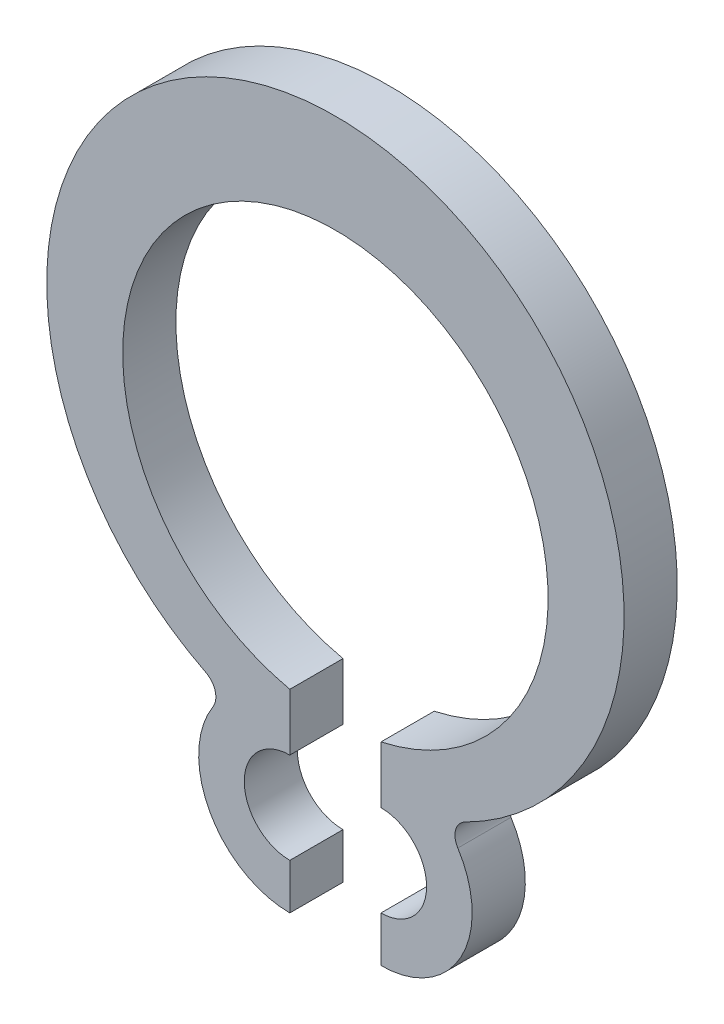
ISO-10303-21;
HEADER;
FILE_DESCRIPTION(('STEP AP214'),'2;1');
FILE_NAME('part.step','',(''),(''),'','','');
FILE_SCHEMA(('AUTOMOTIVE_DESIGN { 1 0 10303 214 1 1 1 1 }'));
ENDSEC;
DATA;
#1=APPLICATION_CONTEXT('core data for automotive mechanical design processes');
#2=APPLICATION_PROTOCOL_DEFINITION('international standard','automotive_design',2000,#1);
#3=PRODUCT_CONTEXT('',#1,'mechanical');
#4=PRODUCT('Part','Part','',(#3));
#5=PRODUCT_RELATED_PRODUCT_CATEGORY('part','',(#4));
#6=PRODUCT_DEFINITION_FORMATION('','',#4);
#7=PRODUCT_DEFINITION_CONTEXT('part definition',#1,'design');
#8=PRODUCT_DEFINITION('design','',#6,#7);
#9=PRODUCT_DEFINITION_SHAPE('','',#8);
#10=(LENGTH_UNIT() NAMED_UNIT(*) SI_UNIT(.MILLI.,.METRE.));
#11=(NAMED_UNIT(*) PLANE_ANGLE_UNIT() SI_UNIT($,.RADIAN.));
#12=(NAMED_UNIT(*) SI_UNIT($,.STERADIAN.) SOLID_ANGLE_UNIT());
#13=UNCERTAINTY_MEASURE_WITH_UNIT(LENGTH_MEASURE(1.E-05),#10,'distance_accuracy_value','');
#14=(GEOMETRIC_REPRESENTATION_CONTEXT(3) GLOBAL_UNCERTAINTY_ASSIGNED_CONTEXT((#13)) GLOBAL_UNIT_ASSIGNED_CONTEXT((#10,
#11,#12)) REPRESENTATION_CONTEXT('',''));
#15=CARTESIAN_POINT('',(0.,0.,0.));
#16=DIRECTION('',(0.,0.,1.));
#17=DIRECTION('',(1.,0.,0.));
#18=AXIS2_PLACEMENT_3D('',#15,#16,#17);
#19=CARTESIAN_POINT('',(-0.6,-4.08495886623547,0.7));
#20=DIRECTION('',(0.,0.,-1.));
#21=DIRECTION('',(-1.,0.,0.));
#22=AXIS2_PLACEMENT_3D('',#19,#20,#21);
#23=CYLINDRICAL_SURFACE('',#22,1.2);
#24=CARTESIAN_POINT('',(-0.6,-4.08495886623547,0.));
#25=DIRECTION('',(0.,0.,1.));
#26=DIRECTION('',(1.,0.,0.));
#27=AXIS2_PLACEMENT_3D('',#24,#25,#26);
#28=CIRCLE('',#27,1.2);
#29=CARTESIAN_POINT('',(-1.61140871688524,-3.43916291749581,0.));
#30=VERTEX_POINT('',#29);
#31=CARTESIAN_POINT('',(-0.6,-5.28495886623547,0.));
#32=VERTEX_POINT('',#31);
#33=EDGE_CURVE('E166',#30,#32,#28,.T.);
#34=ORIENTED_EDGE('',*,*,#33,.T.);
#35=DIRECTION('',(0.,0.,-1.));
#36=VECTOR('',#35,1.);
#37=CARTESIAN_POINT('',(-0.6,-5.28495886623547,0.7));
#38=LINE('',#37,#36);
#39=CARTESIAN_POINT('',(-0.6,-5.28495886623547,0.7));
#40=VERTEX_POINT('',#39);
#41=EDGE_CURVE('E11',#40,#32,#38,.T.);
#42=ORIENTED_EDGE('',*,*,#41,.F.);
#43=CARTESIAN_POINT('',(-0.6,-4.08495886623547,0.7));
#44=DIRECTION('',(0.,0.,1.));
#45=DIRECTION('',(1.,0.,0.));
#46=AXIS2_PLACEMENT_3D('',#43,#44,#45);
#47=CIRCLE('',#46,1.2);
#48=CARTESIAN_POINT('',(-1.61140871688524,-3.43916291749581,0.7));
#49=VERTEX_POINT('',#48);
#50=EDGE_CURVE('E189',#49,#40,#47,.T.);
#51=ORIENTED_EDGE('',*,*,#50,.F.);
#52=DIRECTION('',(0.,0.,-1.));
#53=VECTOR('',#52,1.);
#54=CARTESIAN_POINT('',(-1.61140871688524,-3.43916291749581,0.7));
#55=LINE('',#54,#53);
#56=EDGE_CURVE('E162',#49,#30,#55,.T.);
#57=ORIENTED_EDGE('',*,*,#56,.T.);
#58=EDGE_LOOP('',(#34,#42,#51,#57));
#59=FACE_BOUND('',#58,.T.);
#60=ADVANCED_FACE('F42',(#59),#23,.T.);
#61=CARTESIAN_POINT('',(-0.6,-4.68495886623547,0.7));
#62=DIRECTION('',(-1.,0.,0.));
#63=DIRECTION('',(0.,-1.,0.));
#64=AXIS2_PLACEMENT_3D('',#61,#62,#63);
#65=PLANE('',#64);
#66=DIRECTION('',(0.,1.,0.));
#67=VECTOR('',#66,1.);
#68=CARTESIAN_POINT('',(-0.6,-4.68495886623547,0.));
#69=LINE('',#68,#67);
#70=CARTESIAN_POINT('',(-0.6,-4.68495886623547,0.));
#71=VERTEX_POINT('',#70);
#72=EDGE_CURVE('E169',#32,#71,#69,.T.);
#73=ORIENTED_EDGE('',*,*,#72,.T.);
#74=DIRECTION('',(0.,0.,-1.));
#75=VECTOR('',#74,1.);
#76=CARTESIAN_POINT('',(-0.6,-4.68495886623547,0.7));
#77=LINE('',#76,#75);
#78=CARTESIAN_POINT('',(-0.6,-4.68495886623547,0.7));
#79=VERTEX_POINT('',#78);
#80=EDGE_CURVE('E50',#79,#71,#77,.T.);
#81=ORIENTED_EDGE('',*,*,#80,.F.);
#82=DIRECTION('',(0.,1.,0.));
#83=VECTOR('',#82,1.);
#84=CARTESIAN_POINT('',(-0.6,-4.68495886623547,0.7));
#85=LINE('',#84,#83);
#86=EDGE_CURVE('E113',#40,#79,#85,.T.);
#87=ORIENTED_EDGE('',*,*,#86,.F.);
#88=ORIENTED_EDGE('',*,*,#41,.T.);
#89=EDGE_LOOP('',(#73,#81,#87,#88));
#90=FACE_BOUND('',#89,.T.);
#91=ADVANCED_FACE('F267',(#90),#65,.F.);
#92=CARTESIAN_POINT('',(-0.6,-4.08495886623547,0.7));
#93=DIRECTION('',(0.,0.,-1.));
#94=DIRECTION('',(-1.,0.,0.));
#95=AXIS2_PLACEMENT_3D('',#92,#93,#94);
#96=CYLINDRICAL_SURFACE('',#95,0.6);
#97=CARTESIAN_POINT('',(-0.6,-4.08495886623547,0.));
#98=DIRECTION('',(0.,0.,-1.));
#99=DIRECTION('',(1.,0.,0.));
#100=AXIS2_PLACEMENT_3D('',#97,#98,#99);
#101=CIRCLE('',#100,0.6);
#102=CARTESIAN_POINT('',(-0.6,-3.48495886623547,0.));
#103=VERTEX_POINT('',#102);
#104=EDGE_CURVE('E171',#71,#103,#101,.T.);
#105=ORIENTED_EDGE('',*,*,#104,.T.);
#106=DIRECTION('',(0.,0.,-1.));
#107=VECTOR('',#106,1.);
#108=CARTESIAN_POINT('',(-0.6,-3.48495886623547,0.7));
#109=LINE('',#108,#107);
#110=CARTESIAN_POINT('',(-0.6,-3.48495886623547,0.7));
#111=VERTEX_POINT('',#110);
#112=EDGE_CURVE('E208',#111,#103,#109,.T.);
#113=ORIENTED_EDGE('',*,*,#112,.F.);
#114=CARTESIAN_POINT('',(-0.6,-4.08495886623547,0.7));
#115=DIRECTION('',(0.,0.,-1.));
#116=DIRECTION('',(1.,0.,0.));
#117=AXIS2_PLACEMENT_3D('',#114,#115,#116);
#118=CIRCLE('',#117,0.6);
#119=EDGE_CURVE('E216',#79,#111,#118,.T.);
#120=ORIENTED_EDGE('',*,*,#119,.F.);
#121=ORIENTED_EDGE('',*,*,#80,.T.);
#122=EDGE_LOOP('',(#105,#113,#120,#121));
#123=FACE_BOUND('',#122,.T.);
#124=ADVANCED_FACE('F214',(#123),#96,.F.);
#125=CARTESIAN_POINT('',(-0.6,-2.73495886623547,0.7));
#126=DIRECTION('',(-1.,0.,0.));
#127=DIRECTION('',(0.,-1.,0.));
#128=AXIS2_PLACEMENT_3D('',#125,#126,#127);
#129=PLANE('',#128);
#130=DIRECTION('',(0.,1.,0.));
#131=VECTOR('',#130,1.);
#132=CARTESIAN_POINT('',(-0.6,-2.73495886623547,0.));
#133=LINE('',#132,#131);
#134=CARTESIAN_POINT('',(-0.599999999999999,-2.73495886623547,0.));
#135=VERTEX_POINT('',#134);
#136=EDGE_CURVE('E173',#103,#135,#133,.T.);
#137=ORIENTED_EDGE('',*,*,#136,.T.);
#138=DIRECTION('',(0.,0.,-1.));
#139=VECTOR('',#138,1.);
#140=CARTESIAN_POINT('',(-0.599999999999999,-2.73495886623547,0.7));
#141=LINE('',#140,#139);
#142=CARTESIAN_POINT('',(-0.599999999999999,-2.73495886623547,0.7));
#143=VERTEX_POINT('',#142);
#144=EDGE_CURVE('E205',#143,#135,#141,.T.);
#145=ORIENTED_EDGE('',*,*,#144,.F.);
#146=DIRECTION('',(0.,1.,0.));
#147=VECTOR('',#146,1.);
#148=CARTESIAN_POINT('',(-0.6,-2.73495886623547,0.7));
#149=LINE('',#148,#147);
#150=EDGE_CURVE('E234',#111,#143,#149,.T.);
#151=ORIENTED_EDGE('',*,*,#150,.F.);
#152=ORIENTED_EDGE('',*,*,#112,.T.);
#153=EDGE_LOOP('',(#137,#145,#151,#152));
#154=FACE_BOUND('',#153,.T.);
#155=ADVANCED_FACE('F225',(#154),#129,.F.);
#156=CARTESIAN_POINT('',(0.,0.,0.7));
#157=DIRECTION('',(0.,0.,-1.));
#158=DIRECTION('',(-1.,0.,0.));
#159=AXIS2_PLACEMENT_3D('',#156,#157,#158);
#160=CYLINDRICAL_SURFACE('',#159,2.8);
#161=CARTESIAN_POINT('',(0.,0.,0.));
#162=DIRECTION('',(0.,0.,-1.));
#163=DIRECTION('',(1.,0.,0.));
#164=AXIS2_PLACEMENT_3D('',#161,#162,#163);
#165=CIRCLE('',#164,2.8);
#166=CARTESIAN_POINT('',(0.6,-2.73495886623547,0.));
#167=VERTEX_POINT('',#166);
#168=EDGE_CURVE('E175',#135,#167,#165,.T.);
#169=ORIENTED_EDGE('',*,*,#168,.T.);
#170=DIRECTION('',(0.,0.,-1.));
#171=VECTOR('',#170,1.);
#172=CARTESIAN_POINT('',(0.6,-2.73495886623547,0.7));
#173=LINE('',#172,#171);
#174=CARTESIAN_POINT('',(0.6,-2.73495886623547,0.7));
#175=VERTEX_POINT('',#174);
#176=EDGE_CURVE('E202',#175,#167,#173,.T.);
#177=ORIENTED_EDGE('',*,*,#176,.F.);
#178=CARTESIAN_POINT('',(0.,0.,0.7));
#179=DIRECTION('',(0.,0.,-1.));
#180=DIRECTION('',(1.,0.,0.));
#181=AXIS2_PLACEMENT_3D('',#178,#179,#180);
#182=CIRCLE('',#181,2.8);
#183=EDGE_CURVE('E231',#143,#175,#182,.T.);
#184=ORIENTED_EDGE('',*,*,#183,.F.);
#185=ORIENTED_EDGE('',*,*,#144,.T.);
#186=EDGE_LOOP('',(#169,#177,#184,#185));
#187=FACE_BOUND('',#186,.T.);
#188=ADVANCED_FACE('F229',(#187),#160,.F.);
#189=CARTESIAN_POINT('',(0.6,-2.73495886623547,0.7));
#190=DIRECTION('',(1.,0.,0.));
#191=DIRECTION('',(0.,1.,0.));
#192=AXIS2_PLACEMENT_3D('',#189,#190,#191);
#193=PLANE('',#192);
#194=DIRECTION('',(0.,-1.,0.));
#195=VECTOR('',#194,1.);
#196=CARTESIAN_POINT('',(0.6,-2.73495886623547,0.));
#197=LINE('',#196,#195);
#198=CARTESIAN_POINT('',(0.6,-3.48495886623547,0.));
#199=VERTEX_POINT('',#198);
#200=EDGE_CURVE('E177',#167,#199,#197,.T.);
#201=ORIENTED_EDGE('',*,*,#200,.T.);
#202=DIRECTION('',(0.,0.,-1.));
#203=VECTOR('',#202,1.);
#204=CARTESIAN_POINT('',(0.6,-3.48495886623547,0.7));
#205=LINE('',#204,#203);
#206=CARTESIAN_POINT('',(0.6,-3.48495886623547,0.7));
#207=VERTEX_POINT('',#206);
#208=EDGE_CURVE('E199',#207,#199,#205,.T.);
#209=ORIENTED_EDGE('',*,*,#208,.F.);
#210=DIRECTION('',(0.,-1.,0.));
#211=VECTOR('',#210,1.);
#212=CARTESIAN_POINT('',(0.6,-2.73495886623547,0.7));
#213=LINE('',#212,#211);
#214=EDGE_CURVE('E233',#175,#207,#213,.T.);
#215=ORIENTED_EDGE('',*,*,#214,.F.);
#216=ORIENTED_EDGE('',*,*,#176,.T.);
#217=EDGE_LOOP('',(#201,#209,#215,#216));
#218=FACE_BOUND('',#217,.T.);
#219=ADVANCED_FACE('F280',(#218),#193,.F.);
#220=CARTESIAN_POINT('',(0.6,-4.08495886623547,0.7));
#221=DIRECTION('',(0.,0.,-1.));
#222=DIRECTION('',(-1.,0.,0.));
#223=AXIS2_PLACEMENT_3D('',#220,#221,#222);
#224=CYLINDRICAL_SURFACE('',#223,0.6);
#225=CARTESIAN_POINT('',(0.6,-4.08495886623547,0.));
#226=DIRECTION('',(0.,0.,-1.));
#227=DIRECTION('',(1.,0.,0.));
#228=AXIS2_PLACEMENT_3D('',#225,#226,#227);
#229=CIRCLE('',#228,0.6);
#230=CARTESIAN_POINT('',(0.6,-4.68495886623547,0.));
#231=VERTEX_POINT('',#230);
#232=EDGE_CURVE('E179',#199,#231,#229,.T.);
#233=ORIENTED_EDGE('',*,*,#232,.T.);
#234=DIRECTION('',(0.,0.,-1.));
#235=VECTOR('',#234,1.);
#236=CARTESIAN_POINT('',(0.6,-4.68495886623547,0.7));
#237=LINE('',#236,#235);
#238=CARTESIAN_POINT('',(0.6,-4.68495886623547,0.7));
#239=VERTEX_POINT('',#238);
#240=EDGE_CURVE('E196',#239,#231,#237,.T.);
#241=ORIENTED_EDGE('',*,*,#240,.F.);
#242=CARTESIAN_POINT('',(0.6,-4.08495886623547,0.7));
#243=DIRECTION('',(0.,0.,-1.));
#244=DIRECTION('',(1.,0.,0.));
#245=AXIS2_PLACEMENT_3D('',#242,#243,#244);
#246=CIRCLE('',#245,0.6);
#247=EDGE_CURVE('E236',#207,#239,#246,.T.);
#248=ORIENTED_EDGE('',*,*,#247,.F.);
#249=ORIENTED_EDGE('',*,*,#208,.T.);
#250=EDGE_LOOP('',(#233,#241,#248,#249));
#251=FACE_BOUND('',#250,.T.);
#252=ADVANCED_FACE('F283',(#251),#224,.F.);
#253=CARTESIAN_POINT('',(0.6,-4.68495886623547,0.7));
#254=DIRECTION('',(1.,0.,0.));
#255=DIRECTION('',(0.,1.,0.));
#256=AXIS2_PLACEMENT_3D('',#253,#254,#255);
#257=PLANE('',#256);
#258=DIRECTION('',(0.,-1.,0.));
#259=VECTOR('',#258,1.);
#260=CARTESIAN_POINT('',(0.6,-4.68495886623547,0.));
#261=LINE('',#260,#259);
#262=CARTESIAN_POINT('',(0.6,-5.28495886623547,0.));
#263=VERTEX_POINT('',#262);
#264=EDGE_CURVE('E181',#231,#263,#261,.T.);
#265=ORIENTED_EDGE('',*,*,#264,.T.);
#266=DIRECTION('',(0.,0.,-1.));
#267=VECTOR('',#266,1.);
#268=CARTESIAN_POINT('',(0.6,-5.28495886623547,0.7));
#269=LINE('',#268,#267);
#270=CARTESIAN_POINT('',(0.6,-5.28495886623547,0.7));
#271=VERTEX_POINT('',#270);
#272=EDGE_CURVE('E193',#271,#263,#269,.T.);
#273=ORIENTED_EDGE('',*,*,#272,.F.);
#274=DIRECTION('',(0.,-1.,0.));
#275=VECTOR('',#274,1.);
#276=CARTESIAN_POINT('',(0.6,-4.68495886623547,0.7));
#277=LINE('',#276,#275);
#278=EDGE_CURVE('E242',#239,#271,#277,.T.);
#279=ORIENTED_EDGE('',*,*,#278,.F.);
#280=ORIENTED_EDGE('',*,*,#240,.T.);
#281=EDGE_LOOP('',(#265,#273,#279,#280));
#282=FACE_BOUND('',#281,.T.);
#283=ADVANCED_FACE('F248',(#282),#257,.F.);
#284=CARTESIAN_POINT('',(0.6,-4.08495886623547,0.7));
#285=DIRECTION('',(0.,0.,-1.));
#286=DIRECTION('',(-1.,0.,0.));
#287=AXIS2_PLACEMENT_3D('',#284,#285,#286);
#288=CYLINDRICAL_SURFACE('',#287,1.2);
#289=CARTESIAN_POINT('',(0.6,-4.08495886623547,0.));
#290=DIRECTION('',(0.,0.,1.));
#291=DIRECTION('',(1.,0.,0.));
#292=AXIS2_PLACEMENT_3D('',#289,#290,#291);
#293=CIRCLE('',#292,1.2);
#294=CARTESIAN_POINT('',(1.61140871688524,-3.43916291749581,0.));
#295=VERTEX_POINT('',#294);
#296=EDGE_CURVE('E183',#263,#295,#293,.T.);
#297=ORIENTED_EDGE('',*,*,#296,.T.);
#298=DIRECTION('',(0.,0.,-1.));
#299=VECTOR('',#298,1.);
#300=CARTESIAN_POINT('',(1.61140871688524,-3.43916291749581,0.7));
#301=LINE('',#300,#299);
#302=CARTESIAN_POINT('',(1.61140871688524,-3.43916291749581,0.7));
#303=VERTEX_POINT('',#302);
#304=EDGE_CURVE('E153',#303,#295,#301,.T.);
#305=ORIENTED_EDGE('',*,*,#304,.F.);
#306=CARTESIAN_POINT('',(0.6,-4.08495886623547,0.7));
#307=DIRECTION('',(0.,0.,1.));
#308=DIRECTION('',(1.,0.,0.));
#309=AXIS2_PLACEMENT_3D('',#306,#307,#308);
#310=CIRCLE('',#309,1.2);
#311=EDGE_CURVE('E144',#271,#303,#310,.T.);
#312=ORIENTED_EDGE('',*,*,#311,.F.);
#313=ORIENTED_EDGE('',*,*,#272,.T.);
#314=EDGE_LOOP('',(#297,#305,#312,#313));
#315=FACE_BOUND('',#314,.T.);
#316=ADVANCED_FACE('F252',(#315),#288,.T.);
#317=CARTESIAN_POINT('',(1.81369046026228,-3.31000372774788,0.7));
#318=DIRECTION('',(0.,0.,-1.));
#319=DIRECTION('',(-1.,0.,0.));
#320=AXIS2_PLACEMENT_3D('',#317,#318,#319);
#321=CYLINDRICAL_SURFACE('',#320,0.239999999999999);
#322=CARTESIAN_POINT('',(1.81369046026228,-3.31000372774788,0.));
#323=DIRECTION('',(0.,0.,-1.));
#324=DIRECTION('',(1.,0.,0.));
#325=AXIS2_PLACEMENT_3D('',#322,#323,#324);
#326=CIRCLE('',#325,0.239999999999999);
#327=CARTESIAN_POINT('',(1.70594647252393,-3.09554806075296,0.));
#328=VERTEX_POINT('',#327);
#329=EDGE_CURVE('E152',#295,#328,#326,.T.);
#330=ORIENTED_EDGE('',*,*,#329,.T.);
#331=DIRECTION('',(0.,0.,-1.));
#332=VECTOR('',#331,1.);
#333=CARTESIAN_POINT('',(1.70594647252393,-3.09554806075296,0.7));
#334=LINE('',#333,#332);
#335=CARTESIAN_POINT('',(1.70594647252393,-3.09554806075296,0.7));
#336=VERTEX_POINT('',#335);
#337=EDGE_CURVE('E149',#336,#328,#334,.T.);
#338=ORIENTED_EDGE('',*,*,#337,.F.);
#339=CARTESIAN_POINT('',(1.81369046026228,-3.31000372774788,0.7));
#340=DIRECTION('',(0.,0.,-1.));
#341=DIRECTION('',(1.,0.,0.));
#342=AXIS2_PLACEMENT_3D('',#339,#340,#341);
#343=CIRCLE('',#342,0.239999999999999);
#344=EDGE_CURVE('E138',#303,#336,#343,.T.);
#345=ORIENTED_EDGE('',*,*,#344,.F.);
#346=ORIENTED_EDGE('',*,*,#304,.T.);
#347=EDGE_LOOP('',(#330,#338,#345,#346));
#348=FACE_BOUND('',#347,.T.);
#349=ADVANCED_FACE('F150',(#348),#321,.F.);
#350=CARTESIAN_POINT('',(0.,0.3,0.7));
#351=DIRECTION('',(0.,0.,-1.));
#352=DIRECTION('',(-1.,0.,0.));
#353=AXIS2_PLACEMENT_3D('',#350,#351,#352);
#354=CYLINDRICAL_SURFACE('',#353,3.8);
#355=CARTESIAN_POINT('',(0.,0.3,0.));
#356=DIRECTION('',(0.,0.,1.));
#357=DIRECTION('',(1.,0.,0.));
#358=AXIS2_PLACEMENT_3D('',#355,#356,#357);
#359=CIRCLE('',#358,3.8);
#360=CARTESIAN_POINT('',(-1.70594647252393,-3.09554806075296,0.));
#361=VERTEX_POINT('',#360);
#362=EDGE_CURVE('E99',#328,#361,#359,.T.);
#363=ORIENTED_EDGE('',*,*,#362,.T.);
#364=DIRECTION('',(0.,0.,-1.));
#365=VECTOR('',#364,1.);
#366=CARTESIAN_POINT('',(-1.70594647252393,-3.09554806075296,0.7));
#367=LINE('',#366,#365);
#368=CARTESIAN_POINT('',(-1.70594647252393,-3.09554806075296,0.7));
#369=VERTEX_POINT('',#368);
#370=EDGE_CURVE('E154',#369,#361,#367,.T.);
#371=ORIENTED_EDGE('',*,*,#370,.F.);
#372=CARTESIAN_POINT('',(0.,0.3,0.7));
#373=DIRECTION('',(0.,0.,1.));
#374=DIRECTION('',(1.,0.,0.));
#375=AXIS2_PLACEMENT_3D('',#372,#373,#374);
#376=CIRCLE('',#375,3.8);
#377=EDGE_CURVE('E142',#336,#369,#376,.T.);
#378=ORIENTED_EDGE('',*,*,#377,.F.);
#379=ORIENTED_EDGE('',*,*,#337,.T.);
#380=EDGE_LOOP('',(#363,#371,#378,#379));
#381=FACE_BOUND('',#380,.T.);
#382=ADVANCED_FACE('F156',(#381),#354,.T.);
#383=CARTESIAN_POINT('',(-1.81369046026228,-3.31000372774788,0.7));
#384=DIRECTION('',(0.,0.,-1.));
#385=DIRECTION('',(-1.,0.,0.));
#386=AXIS2_PLACEMENT_3D('',#383,#384,#385);
#387=CYLINDRICAL_SURFACE('',#386,0.239999999999999);
#388=CARTESIAN_POINT('',(-1.81369046026228,-3.31000372774788,0.));
#389=DIRECTION('',(0.,0.,-1.));
#390=DIRECTION('',(1.,0.,0.));
#391=AXIS2_PLACEMENT_3D('',#388,#389,#390);
#392=CIRCLE('',#391,0.239999999999999);
#393=EDGE_CURVE('E105',#361,#30,#392,.T.);
#394=ORIENTED_EDGE('',*,*,#393,.T.);
#395=ORIENTED_EDGE('',*,*,#56,.F.);
#396=CARTESIAN_POINT('',(-1.81369046026228,-3.31000372774788,0.7));
#397=DIRECTION('',(0.,0.,-1.));
#398=DIRECTION('',(1.,0.,0.));
#399=AXIS2_PLACEMENT_3D('',#396,#397,#398);
#400=CIRCLE('',#399,0.239999999999999);
#401=EDGE_CURVE('E58',#369,#49,#400,.T.);
#402=ORIENTED_EDGE('',*,*,#401,.F.);
#403=ORIENTED_EDGE('',*,*,#370,.T.);
#404=EDGE_LOOP('',(#394,#395,#402,#403));
#405=FACE_BOUND('',#404,.T.);
#406=ADVANCED_FACE('F256',(#405),#387,.F.);
#407=CARTESIAN_POINT('',(-0.6,-4.08495886623547,0.7));
#408=DIRECTION('',(0.,0.,1.));
#409=DIRECTION('',(1.,0.,0.));
#410=AXIS2_PLACEMENT_3D('',#407,#408,#409);
#411=PLANE('',#410);
#412=ORIENTED_EDGE('',*,*,#50,.T.);
#413=ORIENTED_EDGE('',*,*,#86,.T.);
#414=ORIENTED_EDGE('',*,*,#119,.T.);
#415=ORIENTED_EDGE('',*,*,#150,.T.);
#416=ORIENTED_EDGE('',*,*,#183,.T.);
#417=ORIENTED_EDGE('',*,*,#214,.T.);
#418=ORIENTED_EDGE('',*,*,#247,.T.);
#419=ORIENTED_EDGE('',*,*,#278,.T.);
#420=ORIENTED_EDGE('',*,*,#311,.T.);
#421=ORIENTED_EDGE('',*,*,#344,.T.);
#422=ORIENTED_EDGE('',*,*,#377,.T.);
#423=ORIENTED_EDGE('',*,*,#401,.T.);
#424=EDGE_LOOP('',(#412,#413,#414,#415,#416,#417,#418,#419,#420,#421,#422,#423));
#425=FACE_BOUND('',#424,.T.);
#426=ADVANCED_FACE('F140',(#425),#411,.T.);
#427=CARTESIAN_POINT('',(-0.6,-4.08495886623547,0.));
#428=DIRECTION('',(0.,0.,1.));
#429=DIRECTION('',(1.,0.,0.));
#430=AXIS2_PLACEMENT_3D('',#427,#428,#429);
#431=PLANE('',#430);
#432=ORIENTED_EDGE('',*,*,#33,.F.);
#433=ORIENTED_EDGE('',*,*,#393,.F.);
#434=ORIENTED_EDGE('',*,*,#362,.F.);
#435=ORIENTED_EDGE('',*,*,#329,.F.);
#436=ORIENTED_EDGE('',*,*,#296,.F.);
#437=ORIENTED_EDGE('',*,*,#264,.F.);
#438=ORIENTED_EDGE('',*,*,#232,.F.);
#439=ORIENTED_EDGE('',*,*,#200,.F.);
#440=ORIENTED_EDGE('',*,*,#168,.F.);
#441=ORIENTED_EDGE('',*,*,#136,.F.);
#442=ORIENTED_EDGE('',*,*,#104,.F.);
#443=ORIENTED_EDGE('',*,*,#72,.F.);
#444=EDGE_LOOP('',(#432,#433,#434,#435,#436,#437,#438,#439,#440,#441,#442,#443));
#445=FACE_BOUND('',#444,.T.);
#446=ADVANCED_FACE('F220',(#445),#431,.F.);
#447=CLOSED_SHELL('',(#60,#91,#124,#155,#188,#219,#252,#283,#316,#349,#382,#406,#426,#446));
#448=MANIFOLD_SOLID_BREP('B2',#447);
#449=ADVANCED_BREP_SHAPE_REPRESENTATION('',(#18,#448),#14);
#450=SHAPE_DEFINITION_REPRESENTATION(#9,#449);
ENDSEC;
END-ISO-10303-21;
